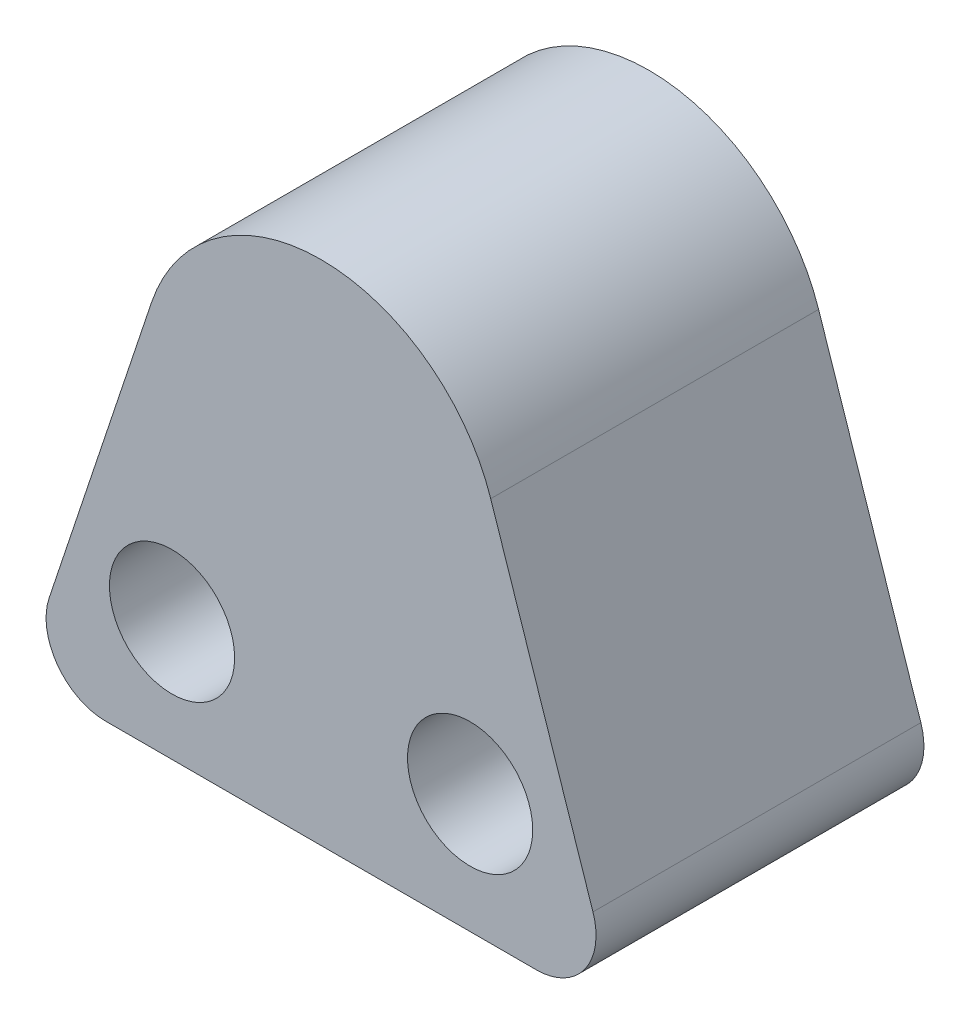
ISO-10303-21;
HEADER;
FILE_DESCRIPTION(('STEP AP214'),'2;1');
FILE_NAME('part.step','',(''),(''),'','','');
FILE_SCHEMA(('AUTOMOTIVE_DESIGN { 1 0 10303 214 1 1 1 1 }'));
ENDSEC;
DATA;
#1=APPLICATION_CONTEXT('core data for automotive mechanical design processes');
#2=APPLICATION_PROTOCOL_DEFINITION('international standard','automotive_design',2000,#1);
#3=PRODUCT_CONTEXT('',#1,'mechanical');
#4=PRODUCT('Part','Part','',(#3));
#5=PRODUCT_RELATED_PRODUCT_CATEGORY('part','',(#4));
#6=PRODUCT_DEFINITION_FORMATION('','',#4);
#7=PRODUCT_DEFINITION_CONTEXT('part definition',#1,'design');
#8=PRODUCT_DEFINITION('design','',#6,#7);
#9=PRODUCT_DEFINITION_SHAPE('','',#8);
#10=(LENGTH_UNIT() NAMED_UNIT(*) SI_UNIT(.MILLI.,.METRE.));
#11=(NAMED_UNIT(*) PLANE_ANGLE_UNIT() SI_UNIT($,.RADIAN.));
#12=(NAMED_UNIT(*) SI_UNIT($,.STERADIAN.) SOLID_ANGLE_UNIT());
#13=UNCERTAINTY_MEASURE_WITH_UNIT(LENGTH_MEASURE(1.E-05),#10,'distance_accuracy_value','');
#14=(GEOMETRIC_REPRESENTATION_CONTEXT(3) GLOBAL_UNCERTAINTY_ASSIGNED_CONTEXT((#13)) GLOBAL_UNIT_ASSIGNED_CONTEXT((#10,
#11,#12)) REPRESENTATION_CONTEXT('',''));
#15=CARTESIAN_POINT('',(0.,0.,0.));
#16=DIRECTION('',(0.,0.,1.));
#17=DIRECTION('',(1.,0.,0.));
#18=AXIS2_PLACEMENT_3D('',#15,#16,#17);
#19=CARTESIAN_POINT('',(-5.,0.,5.5));
#20=DIRECTION('',(0.948683298050514,-0.316227766016838,0.));
#21=DIRECTION('',(0.316227766016838,0.948683298050514,0.));
#22=AXIS2_PLACEMENT_3D('',#19,#20,#21);
#23=PLANE('',#22);
#24=DIRECTION('',(-0.316227766016838,-0.948683298050514,0.));
#25=VECTOR('',#24,1.);
#26=CARTESIAN_POINT('',(-5.,0.,5.5));
#27=LINE('',#26,#25);
#28=CARTESIAN_POINT('',(-2.84604989415154,6.46185031754537,5.5));
#29=VERTEX_POINT('',#28);
#30=CARTESIAN_POINT('',(-4.56125741132772,1.31622776601684,5.5));
#31=VERTEX_POINT('',#30);
#32=EDGE_CURVE('E102',#29,#31,#27,.T.);
#33=ORIENTED_EDGE('',*,*,#32,.F.);
#34=DIRECTION('',(0.,0.,-1.));
#35=VECTOR('',#34,1.);
#36=CARTESIAN_POINT('',(-2.84604989415154,6.46185031754537,5.5));
#37=LINE('',#36,#35);
#38=CARTESIAN_POINT('',(-2.84604989415154,6.46185031754537,0.));
#39=VERTEX_POINT('',#38);
#40=EDGE_CURVE('E123',#29,#39,#37,.T.);
#41=ORIENTED_EDGE('',*,*,#40,.T.);
#42=DIRECTION('',(-0.316227766016838,-0.948683298050514,0.));
#43=VECTOR('',#42,1.);
#44=CARTESIAN_POINT('',(-5.,0.,0.));
#45=LINE('',#44,#43);
#46=CARTESIAN_POINT('',(-4.56125741132772,1.31622776601684,0.));
#47=VERTEX_POINT('',#46);
#48=EDGE_CURVE('E107',#39,#47,#45,.T.);
#49=ORIENTED_EDGE('',*,*,#48,.T.);
#50=DIRECTION('',(0.,0.,-1.));
#51=VECTOR('',#50,1.);
#52=CARTESIAN_POINT('',(-4.56125741132772,1.31622776601684,5.5));
#53=LINE('',#52,#51);
#54=EDGE_CURVE('E120',#47,#31,#53,.F.);
#55=ORIENTED_EDGE('',*,*,#54,.T.);
#56=EDGE_LOOP('',(#33,#41,#49,#55));
#57=FACE_BOUND('',#56,.T.);
#58=ADVANCED_FACE('F33',(#57),#23,.F.);
#59=CARTESIAN_POINT('',(-5.,0.,5.5));
#60=DIRECTION('',(0.,1.,0.));
#61=DIRECTION('',(-1.,0.,0.));
#62=AXIS2_PLACEMENT_3D('',#59,#60,#61);
#63=PLANE('',#62);
#64=DIRECTION('',(1.,0.,0.));
#65=VECTOR('',#64,1.);
#66=CARTESIAN_POINT('',(-5.,0.,0.));
#67=LINE('',#66,#65);
#68=CARTESIAN_POINT('',(-3.61257411327721,0.,0.));
#69=VERTEX_POINT('',#68);
#70=CARTESIAN_POINT('',(3.61257411327721,0.,0.));
#71=VERTEX_POINT('',#70);
#72=EDGE_CURVE('E103',#69,#71,#67,.T.);
#73=ORIENTED_EDGE('',*,*,#72,.T.);
#74=DIRECTION('',(0.,0.,-1.));
#75=VECTOR('',#74,1.);
#76=CARTESIAN_POINT('',(3.61257411327721,0.,5.5));
#77=LINE('',#76,#75);
#78=CARTESIAN_POINT('',(3.61257411327721,0.,5.5));
#79=VERTEX_POINT('',#78);
#80=EDGE_CURVE('E91',#71,#79,#77,.F.);
#81=ORIENTED_EDGE('',*,*,#80,.T.);
#82=DIRECTION('',(1.,0.,0.));
#83=VECTOR('',#82,1.);
#84=CARTESIAN_POINT('',(-5.,0.,5.5));
#85=LINE('',#84,#83);
#86=CARTESIAN_POINT('',(-3.61257411327721,0.,5.5));
#87=VERTEX_POINT('',#86);
#88=EDGE_CURVE('E105',#87,#79,#85,.T.);
#89=ORIENTED_EDGE('',*,*,#88,.F.);
#90=DIRECTION('',(0.,0.,-1.));
#91=VECTOR('',#90,1.);
#92=CARTESIAN_POINT('',(-3.61257411327721,0.,5.5));
#93=LINE('',#92,#91);
#94=EDGE_CURVE('E94',#87,#69,#93,.T.);
#95=ORIENTED_EDGE('',*,*,#94,.T.);
#96=EDGE_LOOP('',(#73,#81,#89,#95));
#97=FACE_BOUND('',#96,.T.);
#98=ADVANCED_FACE('F165',(#97),#63,.F.);
#99=CARTESIAN_POINT('',(0.,15.,5.5));
#100=DIRECTION('',(-0.948683298050514,-0.316227766016838,0.));
#101=DIRECTION('',(0.316227766016838,-0.948683298050514,0.));
#102=AXIS2_PLACEMENT_3D('',#99,#100,#101);
#103=PLANE('',#102);
#104=DIRECTION('',(-0.316227766016838,0.948683298050514,0.));
#105=VECTOR('',#104,1.);
#106=CARTESIAN_POINT('',(0.,15.,0.));
#107=LINE('',#106,#105);
#108=CARTESIAN_POINT('',(4.56125741132772,1.31622776601684,0.));
#109=VERTEX_POINT('',#108);
#110=CARTESIAN_POINT('',(2.84604989415154,6.46185031754537,0.));
#111=VERTEX_POINT('',#110);
#112=EDGE_CURVE('E98',#109,#111,#107,.T.);
#113=ORIENTED_EDGE('',*,*,#112,.T.);
#114=DIRECTION('',(0.,0.,-1.));
#115=VECTOR('',#114,1.);
#116=CARTESIAN_POINT('',(2.84604989415154,6.46185031754537,5.5));
#117=LINE('',#116,#115);
#118=CARTESIAN_POINT('',(2.84604989415154,6.46185031754537,5.5));
#119=VERTEX_POINT('',#118);
#120=EDGE_CURVE('E41',#111,#119,#117,.F.);
#121=ORIENTED_EDGE('',*,*,#120,.T.);
#122=DIRECTION('',(-0.316227766016838,0.948683298050514,0.));
#123=VECTOR('',#122,1.);
#124=CARTESIAN_POINT('',(0.,15.,5.5));
#125=LINE('',#124,#123);
#126=CARTESIAN_POINT('',(4.56125741132772,1.31622776601684,5.5));
#127=VERTEX_POINT('',#126);
#128=EDGE_CURVE('E99',#127,#119,#125,.T.);
#129=ORIENTED_EDGE('',*,*,#128,.F.);
#130=DIRECTION('',(0.,0.,-1.));
#131=VECTOR('',#130,1.);
#132=CARTESIAN_POINT('',(4.56125741132772,1.31622776601684,5.5));
#133=LINE('',#132,#131);
#134=EDGE_CURVE('E90',#127,#109,#133,.T.);
#135=ORIENTED_EDGE('',*,*,#134,.T.);
#136=EDGE_LOOP('',(#113,#121,#129,#135));
#137=FACE_BOUND('',#136,.T.);
#138=ADVANCED_FACE('F97',(#137),#103,.F.);
#139=CARTESIAN_POINT('',(0.,0.,5.5));
#140=DIRECTION('',(0.,0.,-1.));
#141=DIRECTION('',(-1.,0.,0.));
#142=AXIS2_PLACEMENT_3D('',#139,#140,#141);
#143=PLANE('',#142);
#144=CARTESIAN_POINT('',(-2.5,2.,5.5));
#145=DIRECTION('',(0.,0.,1.));
#146=DIRECTION('',(1.,0.,0.));
#147=AXIS2_PLACEMENT_3D('',#144,#145,#146);
#148=CIRCLE('',#147,1.05);
#149=CARTESIAN_POINT('',(-1.45,2.,5.5));
#150=VERTEX_POINT('',#149);
#151=EDGE_CURVE('E134',#150,#150,#148,.T.);
#152=ORIENTED_EDGE('',*,*,#151,.F.);
#153=EDGE_LOOP('',(#152));
#154=FACE_BOUND('',#153,.T.);
#155=CARTESIAN_POINT('',(2.5,2.,5.5));
#156=DIRECTION('',(0.,0.,1.));
#157=DIRECTION('',(1.,0.,0.));
#158=AXIS2_PLACEMENT_3D('',#155,#156,#157);
#159=CIRCLE('',#158,1.05);
#160=CARTESIAN_POINT('',(3.55,2.,5.5));
#161=VERTEX_POINT('',#160);
#162=EDGE_CURVE('E140',#161,#161,#159,.T.);
#163=ORIENTED_EDGE('',*,*,#162,.F.);
#164=EDGE_LOOP('',(#163));
#165=FACE_BOUND('',#164,.T.);
#166=ORIENTED_EDGE('',*,*,#128,.T.);
#167=CARTESIAN_POINT('',(0.,5.51316701949486,5.5));
#168=DIRECTION('',(0.,0.,-1.));
#169=DIRECTION('',(-1.,0.,0.));
#170=AXIS2_PLACEMENT_3D('',#167,#168,#169);
#171=CIRCLE('',#170,3.);
#172=EDGE_CURVE('E11',#119,#29,#171,.F.);
#173=ORIENTED_EDGE('',*,*,#172,.T.);
#174=ORIENTED_EDGE('',*,*,#32,.T.);
#175=CARTESIAN_POINT('',(-3.61257411327721,1.,5.5));
#176=DIRECTION('',(0.,0.,-1.));
#177=DIRECTION('',(-1.,0.,0.));
#178=AXIS2_PLACEMENT_3D('',#175,#176,#177);
#179=CIRCLE('',#178,1.);
#180=EDGE_CURVE('E116',#31,#87,#179,.F.);
#181=ORIENTED_EDGE('',*,*,#180,.T.);
#182=ORIENTED_EDGE('',*,*,#88,.T.);
#183=CARTESIAN_POINT('',(3.61257411327721,1.,5.5));
#184=DIRECTION('',(0.,0.,-1.));
#185=DIRECTION('',(-1.,0.,0.));
#186=AXIS2_PLACEMENT_3D('',#183,#184,#185);
#187=CIRCLE('',#186,1.);
#188=EDGE_CURVE('E118',#79,#127,#187,.F.);
#189=ORIENTED_EDGE('',*,*,#188,.T.);
#190=EDGE_LOOP('',(#166,#173,#174,#181,#182,#189));
#191=FACE_BOUND('',#190,.T.);
#192=ADVANCED_FACE('F151',(#154,#165,#191),#143,.F.);
#193=CARTESIAN_POINT('',(0.,0.,0.));
#194=DIRECTION('',(0.,0.,-1.));
#195=DIRECTION('',(-1.,0.,0.));
#196=AXIS2_PLACEMENT_3D('',#193,#194,#195);
#197=PLANE('',#196);
#198=CARTESIAN_POINT('',(-2.5,2.,0.));
#199=DIRECTION('',(0.,0.,1.));
#200=DIRECTION('',(1.,0.,0.));
#201=AXIS2_PLACEMENT_3D('',#198,#199,#200);
#202=CIRCLE('',#201,1.05);
#203=CARTESIAN_POINT('',(-1.45,2.,0.));
#204=VERTEX_POINT('',#203);
#205=EDGE_CURVE('E132',#204,#204,#202,.T.);
#206=ORIENTED_EDGE('',*,*,#205,.T.);
#207=EDGE_LOOP('',(#206));
#208=FACE_BOUND('',#207,.T.);
#209=CARTESIAN_POINT('',(2.5,2.,0.));
#210=DIRECTION('',(0.,0.,1.));
#211=DIRECTION('',(1.,0.,0.));
#212=AXIS2_PLACEMENT_3D('',#209,#210,#211);
#213=CIRCLE('',#212,1.05);
#214=CARTESIAN_POINT('',(3.55,2.,0.));
#215=VERTEX_POINT('',#214);
#216=EDGE_CURVE('E143',#215,#215,#213,.T.);
#217=ORIENTED_EDGE('',*,*,#216,.T.);
#218=EDGE_LOOP('',(#217));
#219=FACE_BOUND('',#218,.T.);
#220=ORIENTED_EDGE('',*,*,#48,.F.);
#221=CARTESIAN_POINT('',(0.,5.51316701949486,0.));
#222=DIRECTION('',(0.,0.,-1.));
#223=DIRECTION('',(-1.,0.,0.));
#224=AXIS2_PLACEMENT_3D('',#221,#222,#223);
#225=CIRCLE('',#224,3.);
#226=EDGE_CURVE('E55',#39,#111,#225,.T.);
#227=ORIENTED_EDGE('',*,*,#226,.T.);
#228=ORIENTED_EDGE('',*,*,#112,.F.);
#229=CARTESIAN_POINT('',(3.61257411327721,1.,0.));
#230=DIRECTION('',(0.,0.,-1.));
#231=DIRECTION('',(-1.,0.,0.));
#232=AXIS2_PLACEMENT_3D('',#229,#230,#231);
#233=CIRCLE('',#232,1.);
#234=EDGE_CURVE('E86',#109,#71,#233,.T.);
#235=ORIENTED_EDGE('',*,*,#234,.T.);
#236=ORIENTED_EDGE('',*,*,#72,.F.);
#237=CARTESIAN_POINT('',(-3.61257411327721,1.,0.));
#238=DIRECTION('',(0.,0.,-1.));
#239=DIRECTION('',(-1.,0.,0.));
#240=AXIS2_PLACEMENT_3D('',#237,#238,#239);
#241=CIRCLE('',#240,1.);
#242=EDGE_CURVE('E95',#69,#47,#241,.T.);
#243=ORIENTED_EDGE('',*,*,#242,.T.);
#244=EDGE_LOOP('',(#220,#227,#228,#235,#236,#243));
#245=FACE_BOUND('',#244,.T.);
#246=ADVANCED_FACE('F101',(#208,#219,#245),#197,.T.);
#247=CARTESIAN_POINT('',(3.61257411327721,1.,5.5));
#248=DIRECTION('',(0.,0.,-1.));
#249=DIRECTION('',(-1.,0.,0.));
#250=AXIS2_PLACEMENT_3D('',#247,#248,#249);
#251=CYLINDRICAL_SURFACE('',#250,1.);
#252=ORIENTED_EDGE('',*,*,#188,.F.);
#253=ORIENTED_EDGE('',*,*,#80,.F.);
#254=ORIENTED_EDGE('',*,*,#234,.F.);
#255=ORIENTED_EDGE('',*,*,#134,.F.);
#256=EDGE_LOOP('',(#252,#253,#254,#255));
#257=FACE_BOUND('',#256,.T.);
#258=ADVANCED_FACE('F89',(#257),#251,.T.);
#259=CARTESIAN_POINT('',(-3.61257411327721,1.,5.5));
#260=DIRECTION('',(0.,0.,-1.));
#261=DIRECTION('',(-1.,0.,0.));
#262=AXIS2_PLACEMENT_3D('',#259,#260,#261);
#263=CYLINDRICAL_SURFACE('',#262,1.);
#264=ORIENTED_EDGE('',*,*,#180,.F.);
#265=ORIENTED_EDGE('',*,*,#54,.F.);
#266=ORIENTED_EDGE('',*,*,#242,.F.);
#267=ORIENTED_EDGE('',*,*,#94,.F.);
#268=EDGE_LOOP('',(#264,#265,#266,#267));
#269=FACE_BOUND('',#268,.T.);
#270=ADVANCED_FACE('F175',(#269),#263,.T.);
#271=CARTESIAN_POINT('',(2.5,2.,0.));
#272=DIRECTION('',(0.,0.,1.));
#273=DIRECTION('',(1.,0.,0.));
#274=AXIS2_PLACEMENT_3D('',#271,#272,#273);
#275=CYLINDRICAL_SURFACE('',#274,1.05);
#276=ORIENTED_EDGE('',*,*,#216,.F.);
#277=EDGE_LOOP('',(#276));
#278=FACE_BOUND('',#277,.T.);
#279=ORIENTED_EDGE('',*,*,#162,.T.);
#280=EDGE_LOOP('',(#279));
#281=FACE_BOUND('',#280,.T.);
#282=ADVANCED_FACE('F161',(#278,#281),#275,.F.);
#283=CARTESIAN_POINT('',(-2.5,2.,0.));
#284=DIRECTION('',(0.,0.,1.));
#285=DIRECTION('',(1.,0.,0.));
#286=AXIS2_PLACEMENT_3D('',#283,#284,#285);
#287=CYLINDRICAL_SURFACE('',#286,1.05);
#288=ORIENTED_EDGE('',*,*,#205,.F.);
#289=EDGE_LOOP('',(#288));
#290=FACE_BOUND('',#289,.T.);
#291=ORIENTED_EDGE('',*,*,#151,.T.);
#292=EDGE_LOOP('',(#291));
#293=FACE_BOUND('',#292,.T.);
#294=ADVANCED_FACE('F149',(#290,#293),#287,.F.);
#295=CARTESIAN_POINT('',(0.,5.51316701949486,5.5));
#296=DIRECTION('',(0.,0.,-1.));
#297=DIRECTION('',(-1.,0.,0.));
#298=AXIS2_PLACEMENT_3D('',#295,#296,#297);
#299=CYLINDRICAL_SURFACE('',#298,3.);
#300=ORIENTED_EDGE('',*,*,#172,.F.);
#301=ORIENTED_EDGE('',*,*,#120,.F.);
#302=ORIENTED_EDGE('',*,*,#226,.F.);
#303=ORIENTED_EDGE('',*,*,#40,.F.);
#304=EDGE_LOOP('',(#300,#301,#302,#303));
#305=FACE_BOUND('',#304,.T.);
#306=ADVANCED_FACE('F35',(#305),#299,.T.);
#307=CLOSED_SHELL('',(#58,#98,#138,#192,#246,#258,#270,#282,#294,#306));
#308=MANIFOLD_SOLID_BREP('B2',#307);
#309=ADVANCED_BREP_SHAPE_REPRESENTATION('',(#18,#308),#14);
#310=SHAPE_DEFINITION_REPRESENTATION(#9,#309);
ENDSEC;
END-ISO-10303-21;
